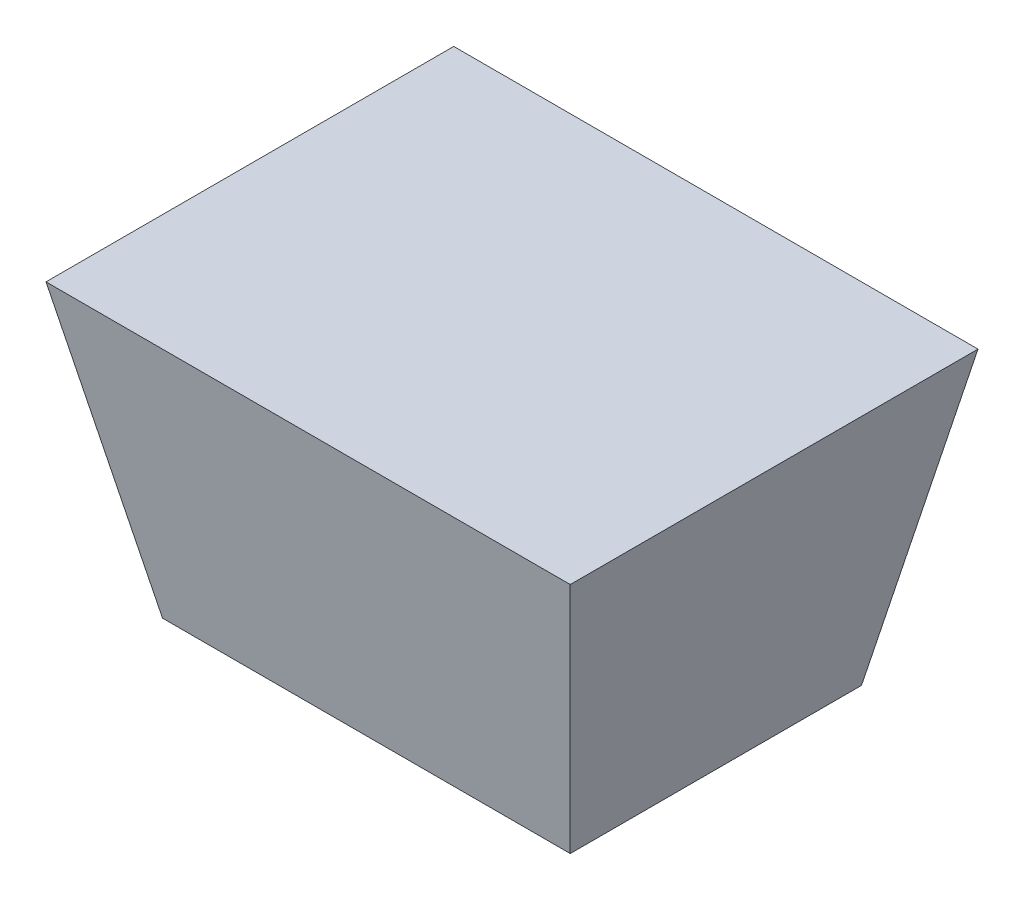
ISO-10303-21;
HEADER;
FILE_DESCRIPTION(('STEP AP214'),'2;1');
FILE_NAME('part.step','',(''),(''),'','','');
FILE_SCHEMA(('AUTOMOTIVE_DESIGN { 1 0 10303 214 1 1 1 1 }'));
ENDSEC;
DATA;
#1=APPLICATION_CONTEXT('core data for automotive mechanical design processes');
#2=APPLICATION_PROTOCOL_DEFINITION('international standard','automotive_design',2000,#1);
#3=PRODUCT_CONTEXT('',#1,'mechanical');
#4=PRODUCT('Part','Part','',(#3));
#5=PRODUCT_RELATED_PRODUCT_CATEGORY('part','',(#4));
#6=PRODUCT_DEFINITION_FORMATION('','',#4);
#7=PRODUCT_DEFINITION_CONTEXT('part definition',#1,'design');
#8=PRODUCT_DEFINITION('design','',#6,#7);
#9=PRODUCT_DEFINITION_SHAPE('','',#8);
#10=(LENGTH_UNIT() NAMED_UNIT(*) SI_UNIT(.MILLI.,.METRE.));
#11=(NAMED_UNIT(*) PLANE_ANGLE_UNIT() SI_UNIT($,.RADIAN.));
#12=(NAMED_UNIT(*) SI_UNIT($,.STERADIAN.) SOLID_ANGLE_UNIT());
#13=UNCERTAINTY_MEASURE_WITH_UNIT(LENGTH_MEASURE(1.E-05),#10,'distance_accuracy_value','');
#14=(GEOMETRIC_REPRESENTATION_CONTEXT(3) GLOBAL_UNCERTAINTY_ASSIGNED_CONTEXT((#13)) GLOBAL_UNIT_ASSIGNED_CONTEXT((#10,
#11,#12)) REPRESENTATION_CONTEXT('',''));
#15=CARTESIAN_POINT('',(0.,0.,0.));
#16=DIRECTION('',(0.,0.,1.));
#17=DIRECTION('',(1.,0.,0.));
#18=AXIS2_PLACEMENT_3D('',#15,#16,#17);
#19=CARTESIAN_POINT('',(0.,0.,0.));
#20=DIRECTION('',(0.,1.,0.));
#21=DIRECTION('',(0.,0.,1.));
#22=AXIS2_PLACEMENT_3D('',#19,#20,#21);
#23=PLANE('',#22);
#24=DIRECTION('',(0.,0.,-1.));
#25=VECTOR('',#24,1.);
#26=CARTESIAN_POINT('',(35.,0.,-25.));
#27=LINE('',#26,#25);
#28=CARTESIAN_POINT('',(35.,0.,25.));
#29=VERTEX_POINT('',#28);
#30=CARTESIAN_POINT('',(35.,0.,-25.));
#31=VERTEX_POINT('',#30);
#32=EDGE_CURVE('E220',#29,#31,#27,.T.);
#33=ORIENTED_EDGE('',*,*,#32,.F.);
#34=DIRECTION('',(1.,0.,0.));
#35=VECTOR('',#34,1.);
#36=CARTESIAN_POINT('',(-35.,0.,25.));
#37=LINE('',#36,#35);
#38=CARTESIAN_POINT('',(-35.,0.,25.));
#39=VERTEX_POINT('',#38);
#40=EDGE_CURVE('E214',#39,#29,#37,.T.);
#41=ORIENTED_EDGE('',*,*,#40,.F.);
#42=DIRECTION('',(0.,0.,1.));
#43=VECTOR('',#42,1.);
#44=CARTESIAN_POINT('',(-35.,0.,-25.));
#45=LINE('',#44,#43);
#46=CARTESIAN_POINT('',(-35.,0.,-25.));
#47=VERTEX_POINT('',#46);
#48=EDGE_CURVE('E60',#47,#39,#45,.T.);
#49=ORIENTED_EDGE('',*,*,#48,.F.);
#50=DIRECTION('',(-1.,0.,0.));
#51=VECTOR('',#50,1.);
#52=CARTESIAN_POINT('',(-35.,0.,-25.));
#53=LINE('',#52,#51);
#54=EDGE_CURVE('E12',#31,#47,#53,.T.);
#55=ORIENTED_EDGE('',*,*,#54,.F.);
#56=EDGE_LOOP('',(#33,#41,#49,#55));
#57=FACE_BOUND('',#56,.T.);
#58=ADVANCED_FACE('F49',(#57),#23,.F.);
#59=CARTESIAN_POINT('',(0.,50.,0.));
#60=DIRECTION('',(0.,1.,0.));
#61=DIRECTION('',(0.,0.,1.));
#62=AXIS2_PLACEMENT_3D('',#59,#60,#61);
#63=PLANE('',#62);
#64=DIRECTION('',(0.,0.,-1.));
#65=VECTOR('',#64,1.);
#66=CARTESIAN_POINT('',(45.,50.,-35.));
#67=LINE('',#66,#65);
#68=CARTESIAN_POINT('',(45.,50.,35.));
#69=VERTEX_POINT('',#68);
#70=CARTESIAN_POINT('',(45.,50.,-35.));
#71=VERTEX_POINT('',#70);
#72=EDGE_CURVE('E120',#69,#71,#67,.T.);
#73=ORIENTED_EDGE('',*,*,#72,.T.);
#74=DIRECTION('',(-1.,0.,0.));
#75=VECTOR('',#74,1.);
#76=CARTESIAN_POINT('',(-45.,50.,-35.));
#77=LINE('',#76,#75);
#78=CARTESIAN_POINT('',(-45.,50.,-35.));
#79=VERTEX_POINT('',#78);
#80=EDGE_CURVE('E102',#71,#79,#77,.T.);
#81=ORIENTED_EDGE('',*,*,#80,.T.);
#82=DIRECTION('',(0.,0.,1.));
#83=VECTOR('',#82,1.);
#84=CARTESIAN_POINT('',(-45.,50.,-35.));
#85=LINE('',#84,#83);
#86=CARTESIAN_POINT('',(-45.,50.,35.));
#87=VERTEX_POINT('',#86);
#88=EDGE_CURVE('E93',#79,#87,#85,.T.);
#89=ORIENTED_EDGE('',*,*,#88,.T.);
#90=DIRECTION('',(1.,0.,0.));
#91=VECTOR('',#90,1.);
#92=CARTESIAN_POINT('',(-45.,50.,35.));
#93=LINE('',#92,#91);
#94=EDGE_CURVE('E98',#87,#69,#93,.T.);
#95=ORIENTED_EDGE('',*,*,#94,.T.);
#96=EDGE_LOOP('',(#73,#81,#89,#95));
#97=FACE_BOUND('',#96,.T.);
#98=ADVANCED_FACE('F97',(#97),#63,.T.);
#99=CARTESIAN_POINT('',(-33.6538461538462,-6.73076923076923,0.));
#100=DIRECTION('',(-0.98058067569092,-0.196116135138184,0.));
#101=DIRECTION('',(0.196116135138184,-0.98058067569092,0.));
#102=AXIS2_PLACEMENT_3D('',#99,#100,#101);
#103=PLANE('',#102);
#104=DIRECTION('',(0.192450089729875,-0.962250448649376,0.192450089729875));
#105=VECTOR('',#104,1.);
#106=CARTESIAN_POINT('',(-45.,50.,-35.));
#107=LINE('',#106,#105);
#108=EDGE_CURVE('E75',#79,#47,#107,.T.);
#109=ORIENTED_EDGE('',*,*,#108,.T.);
#110=ORIENTED_EDGE('',*,*,#48,.T.);
#111=DIRECTION('',(0.192450089729875,-0.962250448649376,-0.192450089729875));
#112=VECTOR('',#111,1.);
#113=CARTESIAN_POINT('',(-45.,50.,35.));
#114=LINE('',#113,#112);
#115=EDGE_CURVE('E115',#87,#39,#114,.T.);
#116=ORIENTED_EDGE('',*,*,#115,.F.);
#117=ORIENTED_EDGE('',*,*,#88,.F.);
#118=EDGE_LOOP('',(#109,#110,#116,#117));
#119=FACE_BOUND('',#118,.T.);
#120=ADVANCED_FACE('F124',(#119),#103,.T.);
#121=CARTESIAN_POINT('',(0.,-4.80769230769231,24.0384615384615));
#122=DIRECTION('',(0.,-0.196116135138184,0.98058067569092));
#123=DIRECTION('',(0.,-0.98058067569092,-0.196116135138184));
#124=AXIS2_PLACEMENT_3D('',#121,#122,#123);
#125=PLANE('',#124);
#126=ORIENTED_EDGE('',*,*,#115,.T.);
#127=ORIENTED_EDGE('',*,*,#40,.T.);
#128=DIRECTION('',(-0.192450089729876,-0.962250448649376,-0.192450089729875));
#129=VECTOR('',#128,1.);
#130=CARTESIAN_POINT('',(45.,50.,35.));
#131=LINE('',#130,#129);
#132=EDGE_CURVE('E118',#69,#29,#131,.T.);
#133=ORIENTED_EDGE('',*,*,#132,.F.);
#134=ORIENTED_EDGE('',*,*,#94,.F.);
#135=EDGE_LOOP('',(#126,#127,#133,#134));
#136=FACE_BOUND('',#135,.T.);
#137=ADVANCED_FACE('F114',(#136),#125,.T.);
#138=CARTESIAN_POINT('',(0.,-4.80769230769231,-24.0384615384615));
#139=DIRECTION('',(0.,-0.196116135138184,-0.98058067569092));
#140=DIRECTION('',(0.,0.98058067569092,-0.196116135138184));
#141=AXIS2_PLACEMENT_3D('',#138,#139,#140);
#142=PLANE('',#141);
#143=DIRECTION('',(-0.192450089729875,-0.962250448649376,0.192450089729875));
#144=VECTOR('',#143,1.);
#145=CARTESIAN_POINT('',(45.,50.,-35.));
#146=LINE('',#145,#144);
#147=EDGE_CURVE('E127',#71,#31,#146,.T.);
#148=ORIENTED_EDGE('',*,*,#147,.T.);
#149=ORIENTED_EDGE('',*,*,#54,.T.);
#150=ORIENTED_EDGE('',*,*,#108,.F.);
#151=ORIENTED_EDGE('',*,*,#80,.F.);
#152=EDGE_LOOP('',(#148,#149,#150,#151));
#153=FACE_BOUND('',#152,.T.);
#154=ADVANCED_FACE('F250',(#153),#142,.T.);
#155=CARTESIAN_POINT('',(33.6538461538461,-6.73076923076924,0.));
#156=DIRECTION('',(0.98058067569092,-0.196116135138184,0.));
#157=DIRECTION('',(0.196116135138184,0.98058067569092,0.));
#158=AXIS2_PLACEMENT_3D('',#155,#156,#157);
#159=PLANE('',#158);
#160=ORIENTED_EDGE('',*,*,#132,.T.);
#161=ORIENTED_EDGE('',*,*,#32,.T.);
#162=ORIENTED_EDGE('',*,*,#147,.F.);
#163=ORIENTED_EDGE('',*,*,#72,.F.);
#164=EDGE_LOOP('',(#160,#161,#162,#163));
#165=FACE_BOUND('',#164,.T.);
#166=ADVANCED_FACE('F242',(#165),#159,.T.);
#167=CLOSED_SHELL('',(#58,#98,#120,#137,#154,#166));
#168=MANIFOLD_SOLID_BREP('B2',#167);
#169=ADVANCED_BREP_SHAPE_REPRESENTATION('',(#18,#168),#14);
#170=SHAPE_DEFINITION_REPRESENTATION(#9,#169);
ENDSEC;
END-ISO-10303-21;
